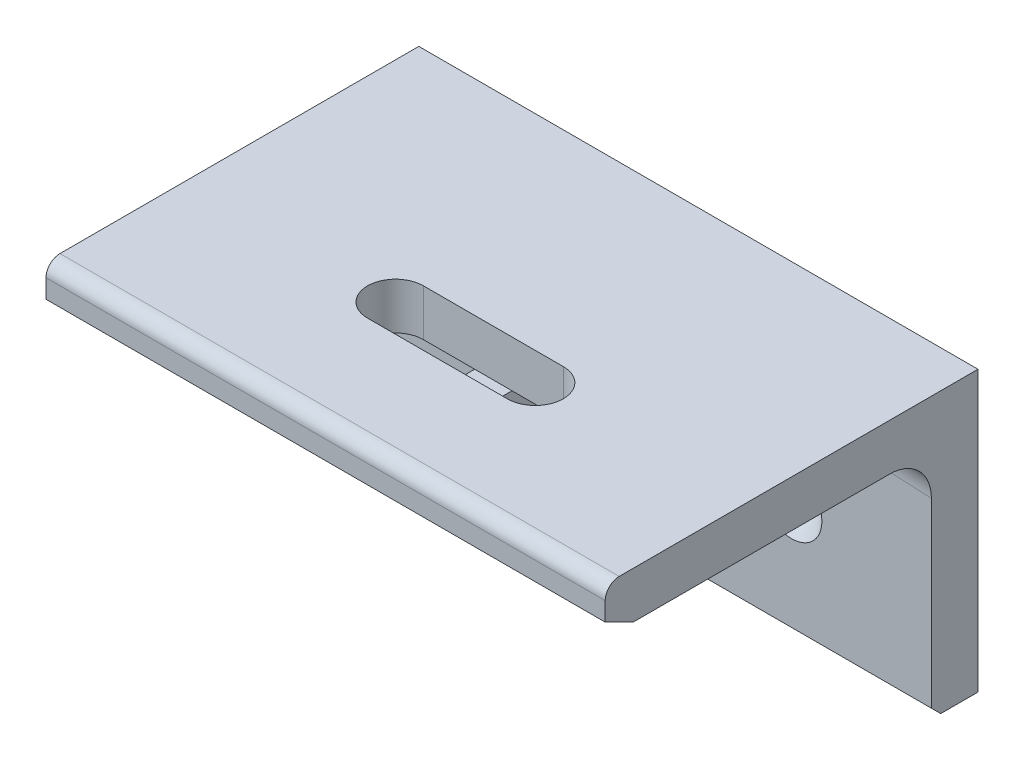
ISO-10303-21;
HEADER;
FILE_DESCRIPTION(('STEP AP214'),'2;1');
FILE_NAME('part.step','',(''),(''),'','','');
FILE_SCHEMA(('AUTOMOTIVE_DESIGN { 1 0 10303 214 1 1 1 1 }'));
ENDSEC;
DATA;
#1=APPLICATION_CONTEXT('core data for automotive mechanical design processes');
#2=APPLICATION_PROTOCOL_DEFINITION('international standard','automotive_design',2000,#1);
#3=PRODUCT_CONTEXT('',#1,'mechanical');
#4=PRODUCT('Part','Part','',(#3));
#5=PRODUCT_RELATED_PRODUCT_CATEGORY('part','',(#4));
#6=PRODUCT_DEFINITION_FORMATION('','',#4);
#7=PRODUCT_DEFINITION_CONTEXT('part definition',#1,'design');
#8=PRODUCT_DEFINITION('design','',#6,#7);
#9=PRODUCT_DEFINITION_SHAPE('','',#8);
#10=(LENGTH_UNIT() NAMED_UNIT(*) SI_UNIT(.MILLI.,.METRE.));
#11=(NAMED_UNIT(*) PLANE_ANGLE_UNIT() SI_UNIT($,.RADIAN.));
#12=(NAMED_UNIT(*) SI_UNIT($,.STERADIAN.) SOLID_ANGLE_UNIT());
#13=UNCERTAINTY_MEASURE_WITH_UNIT(LENGTH_MEASURE(1.E-05),#10,'distance_accuracy_value','');
#14=(GEOMETRIC_REPRESENTATION_CONTEXT(3) GLOBAL_UNCERTAINTY_ASSIGNED_CONTEXT((#13)) GLOBAL_UNIT_ASSIGNED_CONTEXT((#10,
#11,#12)) REPRESENTATION_CONTEXT('',''));
#15=CARTESIAN_POINT('',(0.,0.,0.));
#16=DIRECTION('',(0.,0.,1.));
#17=DIRECTION('',(1.,0.,0.));
#18=AXIS2_PLACEMENT_3D('',#15,#16,#17);
#19=CARTESIAN_POINT('',(0.,50.,0.));
#20=DIRECTION('',(0.,-1.,0.));
#21=DIRECTION('',(0.,0.,-1.));
#22=AXIS2_PLACEMENT_3D('',#19,#20,#21);
#23=PLANE('',#22);
#24=DIRECTION('',(-1.,0.,0.));
#25=VECTOR('',#24,1.);
#26=CARTESIAN_POINT('',(45.,50.,44.));
#27=LINE('',#26,#25);
#28=CARTESIAN_POINT('',(75.,50.,44.));
#29=VERTEX_POINT('',#28);
#30=CARTESIAN_POINT('',(64.,50.,44.));
#31=VERTEX_POINT('',#30);
#32=EDGE_CURVE('E218',#29,#31,#27,.T.);
#33=ORIENTED_EDGE('',*,*,#32,.T.);
#34=DIRECTION('',(0.,0.,1.));
#35=VECTOR('',#34,1.);
#36=CARTESIAN_POINT('',(64.,50.,60.));
#37=LINE('',#36,#35);
#38=CARTESIAN_POINT('',(64.,50.,16.2));
#39=VERTEX_POINT('',#38);
#40=EDGE_CURVE('E307',#39,#31,#37,.T.);
#41=ORIENTED_EDGE('',*,*,#40,.F.);
#42=DIRECTION('',(0.998752338877845,0.,0.0499376169438922));
#43=VECTOR('',#42,1.);
#44=CARTESIAN_POINT('',(0.,50.,13.));
#45=LINE('',#44,#43);
#46=CARTESIAN_POINT('',(120.,50.,19.));
#47=VERTEX_POINT('',#46);
#48=EDGE_CURVE('E397',#39,#47,#45,.T.);
#49=ORIENTED_EDGE('',*,*,#48,.T.);
#50=DIRECTION('',(0.,0.,-1.));
#51=VECTOR('',#50,1.);
#52=CARTESIAN_POINT('',(120.,50.,0.));
#53=LINE('',#52,#51);
#54=CARTESIAN_POINT('',(120.,50.,74.));
#55=VERTEX_POINT('',#54);
#56=EDGE_CURVE('E535',#55,#47,#53,.T.);
#57=ORIENTED_EDGE('',*,*,#56,.F.);
#58=DIRECTION('',(-1.,0.,0.));
#59=VECTOR('',#58,1.);
#60=CARTESIAN_POINT('',(120.007813014407,50.,74.));
#61=LINE('',#60,#59);
#62=CARTESIAN_POINT('',(0.,50.,74.));
#63=VERTEX_POINT('',#62);
#64=EDGE_CURVE('E292',#55,#63,#61,.T.);
#65=ORIENTED_EDGE('',*,*,#64,.T.);
#66=DIRECTION('',(0.,0.,1.));
#67=VECTOR('',#66,1.);
#68=CARTESIAN_POINT('',(0.,50.,80.));
#69=LINE('',#68,#67);
#70=CARTESIAN_POINT('',(0.,50.,13.));
#71=VERTEX_POINT('',#70);
#72=EDGE_CURVE('E592',#71,#63,#69,.T.);
#73=ORIENTED_EDGE('',*,*,#72,.F.);
#74=CARTESIAN_POINT('',(56.,50.,15.8));
#75=VERTEX_POINT('',#74);
#76=EDGE_CURVE('E349',#71,#75,#45,.T.);
#77=ORIENTED_EDGE('',*,*,#76,.T.);
#78=DIRECTION('',(0.,0.,1.));
#79=VECTOR('',#78,1.);
#80=CARTESIAN_POINT('',(56.,50.,60.));
#81=LINE('',#80,#79);
#82=CARTESIAN_POINT('',(56.,50.,44.));
#83=VERTEX_POINT('',#82);
#84=EDGE_CURVE('E321',#75,#83,#81,.T.);
#85=ORIENTED_EDGE('',*,*,#84,.T.);
#86=CARTESIAN_POINT('',(45.,50.,44.));
#87=VERTEX_POINT('',#86);
#88=EDGE_CURVE('E232',#83,#87,#27,.T.);
#89=ORIENTED_EDGE('',*,*,#88,.T.);
#90=CARTESIAN_POINT('',(45.,50.,50.));
#91=DIRECTION('',(0.,1.,0.));
#92=DIRECTION('',(0.,0.,-1.));
#93=AXIS2_PLACEMENT_3D('',#90,#91,#92);
#94=CIRCLE('',#93,6.);
#95=CARTESIAN_POINT('',(45.,50.,56.));
#96=VERTEX_POINT('',#95);
#97=EDGE_CURVE('E211',#87,#96,#94,.T.);
#98=ORIENTED_EDGE('',*,*,#97,.T.);
#99=DIRECTION('',(1.,0.,0.));
#100=VECTOR('',#99,1.);
#101=CARTESIAN_POINT('',(75.,50.,56.));
#102=LINE('',#101,#100);
#103=CARTESIAN_POINT('',(56.,50.,56.));
#104=VERTEX_POINT('',#103);
#105=EDGE_CURVE('E221',#96,#104,#102,.T.);
#106=ORIENTED_EDGE('',*,*,#105,.T.);
#107=CARTESIAN_POINT('',(56.,50.,60.));
#108=VERTEX_POINT('',#107);
#109=EDGE_CURVE('E306',#104,#108,#81,.T.);
#110=ORIENTED_EDGE('',*,*,#109,.T.);
#111=DIRECTION('',(-1.,0.,0.));
#112=VECTOR('',#111,1.);
#113=CARTESIAN_POINT('',(64.,50.,60.));
#114=LINE('',#113,#112);
#115=CARTESIAN_POINT('',(64.,50.,60.));
#116=VERTEX_POINT('',#115);
#117=EDGE_CURVE('E335',#116,#108,#114,.T.);
#118=ORIENTED_EDGE('',*,*,#117,.F.);
#119=CARTESIAN_POINT('',(64.,50.,56.));
#120=VERTEX_POINT('',#119);
#121=EDGE_CURVE('E312',#120,#116,#37,.T.);
#122=ORIENTED_EDGE('',*,*,#121,.F.);
#123=CARTESIAN_POINT('',(75.,50.,56.));
#124=VERTEX_POINT('',#123);
#125=EDGE_CURVE('E228',#120,#124,#102,.T.);
#126=ORIENTED_EDGE('',*,*,#125,.T.);
#127=CARTESIAN_POINT('',(75.,50.,50.));
#128=DIRECTION('',(0.,1.,0.));
#129=DIRECTION('',(0.,0.,-1.));
#130=AXIS2_PLACEMENT_3D('',#127,#128,#129);
#131=CIRCLE('',#130,6.);
#132=EDGE_CURVE('E226',#124,#29,#131,.T.);
#133=ORIENTED_EDGE('',*,*,#132,.T.);
#134=EDGE_LOOP('',(#33,#41,#49,#57,#65,#73,#77,#85,#89,#98,#106,#110,#118,#122,#126,#133));
#135=FACE_BOUND('',#134,.T.);
#136=ADVANCED_FACE('F71',(#135),#23,.T.);
#137=CARTESIAN_POINT('',(0.,60.,10.));
#138=DIRECTION('',(1.,0.,0.));
#139=DIRECTION('',(0.,0.,-1.));
#140=AXIS2_PLACEMENT_3D('',#137,#138,#139);
#141=PLANE('',#140);
#142=DIRECTION('',(0.,0.,-1.));
#143=VECTOR('',#142,1.);
#144=CARTESIAN_POINT('',(0.,0.,10.));
#145=LINE('',#144,#143);
#146=CARTESIAN_POINT('',(0.,0.,7.99999999999998));
#147=VERTEX_POINT('',#146);
#148=CARTESIAN_POINT('',(0.,0.,0.));
#149=VERTEX_POINT('',#148);
#150=EDGE_CURVE('E396',#147,#149,#145,.T.);
#151=ORIENTED_EDGE('',*,*,#150,.F.);
#152=DIRECTION('',(0.,0.707106781186545,0.70710678118655));
#153=VECTOR('',#152,1.);
#154=CARTESIAN_POINT('',(0.,2.,10.));
#155=LINE('',#154,#153);
#156=CARTESIAN_POINT('',(0.,2.,10.));
#157=VERTEX_POINT('',#156);
#158=EDGE_CURVE('E12',#147,#157,#155,.T.);
#159=ORIENTED_EDGE('',*,*,#158,.T.);
#160=DIRECTION('',(0.,-1.,0.));
#161=VECTOR('',#160,1.);
#162=CARTESIAN_POINT('',(0.,60.,10.));
#163=LINE('',#162,#161);
#164=CARTESIAN_POINT('',(0.,47.,10.));
#165=VERTEX_POINT('',#164);
#166=EDGE_CURVE('E559',#165,#157,#163,.T.);
#167=ORIENTED_EDGE('',*,*,#166,.F.);
#168=CARTESIAN_POINT('',(0.,47.,13.));
#169=DIRECTION('',(-1.,0.,0.));
#170=DIRECTION('',(0.,0.,-1.));
#171=AXIS2_PLACEMENT_3D('',#168,#169,#170);
#172=CIRCLE('',#171,3.);
#173=EDGE_CURVE('E339',#71,#165,#172,.T.);
#174=ORIENTED_EDGE('',*,*,#173,.F.);
#175=ORIENTED_EDGE('',*,*,#72,.T.);
#176=DIRECTION('',(0.,-0.447213595499957,-0.894427190999916));
#177=VECTOR('',#176,1.);
#178=CARTESIAN_POINT('',(0.,26.4,26.7999999999999));
#179=LINE('',#178,#177);
#180=CARTESIAN_POINT('',(0.,53.,80.));
#181=VERTEX_POINT('',#180);
#182=EDGE_CURVE('E303',#181,#63,#179,.T.);
#183=ORIENTED_EDGE('',*,*,#182,.F.);
#184=DIRECTION('',(0.,-1.,0.));
#185=VECTOR('',#184,1.);
#186=CARTESIAN_POINT('',(0.,60.,80.));
#187=LINE('',#186,#185);
#188=CARTESIAN_POINT('',(0.,57.,80.));
#189=VERTEX_POINT('',#188);
#190=EDGE_CURVE('E534',#189,#181,#187,.T.);
#191=ORIENTED_EDGE('',*,*,#190,.F.);
#192=CARTESIAN_POINT('',(0.,57.,77.));
#193=DIRECTION('',(1.,0.,0.));
#194=DIRECTION('',(0.,0.,-1.));
#195=AXIS2_PLACEMENT_3D('',#192,#193,#194);
#196=CIRCLE('',#195,3.);
#197=CARTESIAN_POINT('',(0.,60.,77.));
#198=VERTEX_POINT('',#197);
#199=EDGE_CURVE('E542',#189,#198,#196,.F.);
#200=ORIENTED_EDGE('',*,*,#199,.T.);
#201=DIRECTION('',(0.,0.,-1.));
#202=VECTOR('',#201,1.);
#203=CARTESIAN_POINT('',(0.,60.,10.));
#204=LINE('',#203,#202);
#205=CARTESIAN_POINT('',(0.,60.,0.));
#206=VERTEX_POINT('',#205);
#207=EDGE_CURVE('E558',#198,#206,#204,.T.);
#208=ORIENTED_EDGE('',*,*,#207,.T.);
#209=DIRECTION('',(0.,-1.,0.));
#210=VECTOR('',#209,1.);
#211=CARTESIAN_POINT('',(0.,60.,0.));
#212=LINE('',#211,#210);
#213=EDGE_CURVE('E566',#206,#149,#212,.T.);
#214=ORIENTED_EDGE('',*,*,#213,.T.);
#215=EDGE_LOOP('',(#151,#159,#167,#174,#175,#183,#191,#200,#208,#214));
#216=FACE_BOUND('',#215,.T.);
#217=ADVANCED_FACE('F464',(#216),#141,.F.);
#218=CARTESIAN_POINT('',(120.,0.,10.));
#219=DIRECTION('',(-1.,0.,0.));
#220=DIRECTION('',(0.,0.,1.));
#221=AXIS2_PLACEMENT_3D('',#218,#219,#220);
#222=PLANE('',#221);
#223=DIRECTION('',(0.,1.,0.));
#224=VECTOR('',#223,1.);
#225=CARTESIAN_POINT('',(120.,0.,10.));
#226=LINE('',#225,#224);
#227=CARTESIAN_POINT('',(120.,2.,10.));
#228=VERTEX_POINT('',#227);
#229=CARTESIAN_POINT('',(120.,41.,10.));
#230=VERTEX_POINT('',#229);
#231=EDGE_CURVE('E554',#228,#230,#226,.T.);
#232=ORIENTED_EDGE('',*,*,#231,.F.);
#233=DIRECTION('',(0.,-0.707106781186545,-0.70710678118655));
#234=VECTOR('',#233,1.);
#235=CARTESIAN_POINT('',(120.,2.,10.));
#236=LINE('',#235,#234);
#237=CARTESIAN_POINT('',(120.,0.,7.99999999999998));
#238=VERTEX_POINT('',#237);
#239=EDGE_CURVE('E660',#228,#238,#236,.T.);
#240=ORIENTED_EDGE('',*,*,#239,.T.);
#241=DIRECTION('',(0.,0.,-1.));
#242=VECTOR('',#241,1.);
#243=CARTESIAN_POINT('',(120.,0.,10.));
#244=LINE('',#243,#242);
#245=CARTESIAN_POINT('',(120.,0.,0.));
#246=VERTEX_POINT('',#245);
#247=EDGE_CURVE('E587',#238,#246,#244,.T.);
#248=ORIENTED_EDGE('',*,*,#247,.T.);
#249=DIRECTION('',(0.,1.,0.));
#250=VECTOR('',#249,1.);
#251=CARTESIAN_POINT('',(120.,0.,0.));
#252=LINE('',#251,#250);
#253=CARTESIAN_POINT('',(120.,60.,0.));
#254=VERTEX_POINT('',#253);
#255=EDGE_CURVE('E574',#246,#254,#252,.T.);
#256=ORIENTED_EDGE('',*,*,#255,.T.);
#257=DIRECTION('',(0.,0.,-1.));
#258=VECTOR('',#257,1.);
#259=CARTESIAN_POINT('',(120.,60.,10.));
#260=LINE('',#259,#258);
#261=CARTESIAN_POINT('',(120.,60.,77.));
#262=VERTEX_POINT('',#261);
#263=EDGE_CURVE('E584',#262,#254,#260,.T.);
#264=ORIENTED_EDGE('',*,*,#263,.F.);
#265=CARTESIAN_POINT('',(120.,57.,77.));
#266=DIRECTION('',(-1.,0.,0.));
#267=DIRECTION('',(0.,0.,1.));
#268=AXIS2_PLACEMENT_3D('',#265,#266,#267);
#269=CIRCLE('',#268,3.);
#270=CARTESIAN_POINT('',(120.,57.,80.));
#271=VERTEX_POINT('',#270);
#272=EDGE_CURVE('E540',#262,#271,#269,.F.);
#273=ORIENTED_EDGE('',*,*,#272,.T.);
#274=DIRECTION('',(0.,-1.,0.));
#275=VECTOR('',#274,1.);
#276=CARTESIAN_POINT('',(120.,60.,80.));
#277=LINE('',#276,#275);
#278=CARTESIAN_POINT('',(120.,53.,80.));
#279=VERTEX_POINT('',#278);
#280=EDGE_CURVE('E526',#271,#279,#277,.T.);
#281=ORIENTED_EDGE('',*,*,#280,.T.);
#282=DIRECTION('',(0.,0.447213595499957,0.894427190999916));
#283=VECTOR('',#282,1.);
#284=CARTESIAN_POINT('',(120.,14.4000000000001,2.79999999999998));
#285=LINE('',#284,#283);
#286=EDGE_CURVE('E299',#55,#279,#285,.T.);
#287=ORIENTED_EDGE('',*,*,#286,.F.);
#288=ORIENTED_EDGE('',*,*,#56,.T.);
#289=CARTESIAN_POINT('',(120.,41.,19.));
#290=DIRECTION('',(-1.,0.,0.));
#291=DIRECTION('',(0.,0.,-1.));
#292=AXIS2_PLACEMENT_3D('',#289,#290,#291);
#293=CIRCLE('',#292,9.00000000000001);
#294=EDGE_CURVE('E496',#47,#230,#293,.T.);
#295=ORIENTED_EDGE('',*,*,#294,.T.);
#296=EDGE_LOOP('',(#232,#240,#248,#256,#264,#273,#281,#287,#288,#295));
#297=FACE_BOUND('',#296,.T.);
#298=ADVANCED_FACE('F467',(#297),#222,.F.);
#299=CARTESIAN_POINT('',(120.,60.,80.));
#300=DIRECTION('',(0.,0.,-1.));
#301=DIRECTION('',(-1.,0.,0.));
#302=AXIS2_PLACEMENT_3D('',#299,#300,#301);
#303=PLANE('',#302);
#304=ORIENTED_EDGE('',*,*,#280,.F.);
#305=DIRECTION('',(1.,0.,0.));
#306=VECTOR('',#305,1.);
#307=CARTESIAN_POINT('',(120.,57.,80.));
#308=LINE('',#307,#306);
#309=EDGE_CURVE('E528',#271,#189,#308,.F.);
#310=ORIENTED_EDGE('',*,*,#309,.T.);
#311=ORIENTED_EDGE('',*,*,#190,.T.);
#312=DIRECTION('',(-1.,0.,0.));
#313=VECTOR('',#312,1.);
#314=CARTESIAN_POINT('',(120.,53.,80.));
#315=LINE('',#314,#313);
#316=EDGE_CURVE('E531',#279,#181,#315,.T.);
#317=ORIENTED_EDGE('',*,*,#316,.F.);
#318=EDGE_LOOP('',(#304,#310,#311,#317));
#319=FACE_BOUND('',#318,.T.);
#320=ADVANCED_FACE('F472',(#319),#303,.F.);
#321=CARTESIAN_POINT('',(0.,0.,10.));
#322=DIRECTION('',(0.,0.,1.));
#323=DIRECTION('',(1.,0.,0.));
#324=AXIS2_PLACEMENT_3D('',#321,#322,#323);
#325=PLANE('',#324);
#326=CARTESIAN_POINT('',(30.,25.,10.));
#327=DIRECTION('',(0.,0.,1.));
#328=DIRECTION('',(1.,0.,0.));
#329=AXIS2_PLACEMENT_3D('',#326,#327,#328);
#330=CIRCLE('',#329,6.5);
#331=CARTESIAN_POINT('',(36.5,25.,10.));
#332=VERTEX_POINT('',#331);
#333=EDGE_CURVE('E288',#332,#332,#330,.T.);
#334=ORIENTED_EDGE('',*,*,#333,.F.);
#335=EDGE_LOOP('',(#334));
#336=FACE_BOUND('',#335,.T.);
#337=CARTESIAN_POINT('',(90.,25.,10.));
#338=DIRECTION('',(0.,0.,1.));
#339=DIRECTION('',(1.,0.,0.));
#340=AXIS2_PLACEMENT_3D('',#337,#338,#339);
#341=CIRCLE('',#340,6.50000000000001);
#342=CARTESIAN_POINT('',(96.5,25.,10.));
#343=VERTEX_POINT('',#342);
#344=EDGE_CURVE('E287',#343,#343,#341,.T.);
#345=ORIENTED_EDGE('',*,*,#344,.F.);
#346=EDGE_LOOP('',(#345));
#347=FACE_BOUND('',#346,.T.);
#348=ORIENTED_EDGE('',*,*,#166,.T.);
#349=DIRECTION('',(1.,0.,0.));
#350=VECTOR('',#349,1.);
#351=CARTESIAN_POINT('',(120.,2.,10.));
#352=LINE('',#351,#350);
#353=EDGE_CURVE('E548',#157,#228,#352,.T.);
#354=ORIENTED_EDGE('',*,*,#353,.T.);
#355=ORIENTED_EDGE('',*,*,#231,.T.);
#356=DIRECTION('',(0.998752338877845,-0.0499376169438922,0.));
#357=VECTOR('',#356,1.);
#358=CARTESIAN_POINT('',(0.,47.,10.));
#359=LINE('',#358,#357);
#360=CARTESIAN_POINT('',(64.,43.8,10.));
#361=VERTEX_POINT('',#360);
#362=EDGE_CURVE('E499',#361,#230,#359,.T.);
#363=ORIENTED_EDGE('',*,*,#362,.F.);
#364=DIRECTION('',(0.,1.,0.));
#365=VECTOR('',#364,1.);
#366=CARTESIAN_POINT('',(64.,50.,10.));
#367=LINE('',#366,#365);
#368=CARTESIAN_POINT('',(64.,10.,10.));
#369=VERTEX_POINT('',#368);
#370=EDGE_CURVE('E316',#369,#361,#367,.T.);
#371=ORIENTED_EDGE('',*,*,#370,.F.);
#372=DIRECTION('',(-1.,0.,0.));
#373=VECTOR('',#372,1.);
#374=CARTESIAN_POINT('',(64.,10.,10.));
#375=LINE('',#374,#373);
#376=CARTESIAN_POINT('',(56.,10.,10.));
#377=VERTEX_POINT('',#376);
#378=EDGE_CURVE('E320',#369,#377,#375,.T.);
#379=ORIENTED_EDGE('',*,*,#378,.T.);
#380=DIRECTION('',(0.,1.,0.));
#381=VECTOR('',#380,1.);
#382=CARTESIAN_POINT('',(56.,50.,10.));
#383=LINE('',#382,#381);
#384=CARTESIAN_POINT('',(56.,44.2,10.));
#385=VERTEX_POINT('',#384);
#386=EDGE_CURVE('E329',#377,#385,#383,.T.);
#387=ORIENTED_EDGE('',*,*,#386,.T.);
#388=EDGE_CURVE('E623',#165,#385,#359,.T.);
#389=ORIENTED_EDGE('',*,*,#388,.F.);
#390=EDGE_LOOP('',(#348,#354,#355,#363,#371,#379,#387,#389));
#391=FACE_BOUND('',#390,.T.);
#392=ADVANCED_FACE('F518',(#336,#347,#391),#325,.T.);
#393=CARTESIAN_POINT('',(0.,50.,13.));
#394=CARTESIAN_POINT('',(120.,50.,19.));
#395=CARTESIAN_POINT('',(0.,50.,12.8232233047034));
#396=CARTESIAN_POINT('',(120.,50.,18.4696699141101));
#397=CARTESIAN_POINT('',(0.,49.9838909458899,12.6394749853199));
#398=CARTESIAN_POINT('',(120.,49.9528548745652,17.9195073583385));
#399=CARTESIAN_POINT('',(0.,49.9151231175766,12.2680439814133));
#400=CARTESIAN_POINT('',(120.,49.7466417569332,16.8051576982429));
#401=CARTESIAN_POINT('',(0.,49.8624643433734,12.0803612968902));
#402=CARTESIAN_POINT('',(120.,49.5873930301202,16.2410838906706));
#403=CARTESIAN_POINT('',(0.,49.7162654630012,11.7110704457386));
#404=CARTESIAN_POINT('',(120.,49.1487963890035,15.1332113372157));
#405=CARTESIAN_POINT('',(0.,49.6224776277976,11.5300346967234));
#406=CARTESIAN_POINT('',(120.,48.8693449899168,14.5896371505096));
#407=CARTESIAN_POINT('',(0.,49.3982283727802,11.1870626067777));
#408=CARTESIAN_POINT('',(120.,48.1965742120189,13.5605872885578));
#409=CARTESIAN_POINT('',(0.,49.2677669529664,11.0251262658471));
#410=CARTESIAN_POINT('',(120.,47.8033008588991,13.0753787975413));
#411=CARTESIAN_POINT('',(0.,48.9748737341529,10.7322330470336));
#412=CARTESIAN_POINT('',(120.,46.9246212024588,12.1966991411009));
#413=CARTESIAN_POINT('',(0.,48.8129373932223,10.6017716272198));
#414=CARTESIAN_POINT('',(120.,46.4394127114422,11.8034257879811));
#415=CARTESIAN_POINT('',(0.,48.4699653032766,10.3775223722024));
#416=CARTESIAN_POINT('',(120.,45.4103628494903,11.1306550100832));
#417=CARTESIAN_POINT('',(0.,48.2889295542615,10.2837345369988));
#418=CARTESIAN_POINT('',(120.,44.8667886627843,10.8512036109965));
#419=CARTESIAN_POINT('',(0.,47.9196387031098,10.1375356566266));
#420=CARTESIAN_POINT('',(120.,43.7589161093294,10.4126069698798));
#421=CARTESIAN_POINT('',(0.,47.7319560185867,10.0848768824234));
#422=CARTESIAN_POINT('',(120.,43.1948423017571,10.2533582430668));
#423=CARTESIAN_POINT('',(0.,47.3605250146801,10.0161090541101));
#424=CARTESIAN_POINT('',(120.,42.0804926416615,10.0471451254348));
#425=CARTESIAN_POINT('',(0.,47.1767766952966,10.));
#426=CARTESIAN_POINT('',(120.,41.5303300858899,10.));
#427=CARTESIAN_POINT('',(0.,47.,10.));
#428=CARTESIAN_POINT('',(120.,41.,10.));
#429=B_SPLINE_SURFACE_WITH_KNOTS('',3,1,((#393,#394),(#395,#396),(#397,#398),(#399,#400),(#401,
#402),(#403,#404),(#405,#406),(#407,#408),(#409,#410),(#411,#412),(#413,#414),(#415,#416),(#417,
#418),(#419,#420),(#421,#422),(#423,#424),(#425,#426),(#427,#428)),.UNSPECIFIED.,.F.,.F.,.F.,(4,
2,2,2,2,2,2,2,4),(2,2),(0.,0.125,0.25,0.375,0.5,0.625,0.75,0.875,1.),(0.,1.),.UNSPECIFIED.);
#430=CARTESIAN_POINT('',(64.,50.,16.2));
#431=CARTESIAN_POINT('',(64.,49.9999687193606,16.0256000696815));
#432=CARTESIAN_POINT('',(64.,49.9925566671614,15.8512007509311));
#433=CARTESIAN_POINT('',(64.,49.9630964198957,15.5036383285874));
#434=CARTESIAN_POINT('',(64.,49.9410478830944,15.3304752539536));
#435=CARTESIAN_POINT('',(64.,49.8824634288315,14.986765556761));
#436=CARTESIAN_POINT('',(64.,49.8459390686207,14.8162169594));
#437=CARTESIAN_POINT('',(64.,49.7587023336513,14.4787724278152));
#438=CARTESIAN_POINT('',(64.,49.7079905668795,14.3118763373974));
#439=CARTESIAN_POINT('',(64.,49.6214918310891,14.0651290822042));
#440=CARTESIAN_POINT('',(64.,49.5908962429059,13.9834255893316));
#441=CARTESIAN_POINT('',(64.,49.5262377182265,13.8214023118593));
#442=CARTESIAN_POINT('',(64.,49.4921747889522,13.7410825243782));
#443=CARTESIAN_POINT('',(64.,49.384936131138,13.5023962976096));
#444=CARTESIAN_POINT('',(64.,49.3066992945905,13.3462709996749));
#445=CARTESIAN_POINT('',(64.,49.1374497723724,13.0411681942608));
#446=CARTESIAN_POINT('',(64.,49.0464395183326,12.8921893335653));
#447=CARTESIAN_POINT('',(64.,48.8521709918913,12.6024466018387));
#448=CARTESIAN_POINT('',(64.,48.7489128230143,12.4616826613868));
#449=CARTESIAN_POINT('',(64.,48.531033502181,12.189346527546));
#450=CARTESIAN_POINT('',(64.,48.4164189462691,12.0577690732743));
#451=CARTESIAN_POINT('',(64.,48.236453493969,11.8680910230294));
#452=CARTESIAN_POINT('',(64.,48.1751177209058,11.8061404176552));
#453=CARTESIAN_POINT('',(64.,48.0498545697312,11.6849169640287));
#454=CARTESIAN_POINT('',(64.,47.9859271670337,11.625644141191));
#455=CARTESIAN_POINT('',(64.,47.7904702478499,11.4519311744386));
#456=CARTESIAN_POINT('',(64.,47.6552579278241,11.341588019893));
#457=CARTESIAN_POINT('',(64.,47.3760764435896,11.1326354487507));
#458=CARTESIAN_POINT('',(64.,47.2321070500518,11.0340263396437));
#459=CARTESIAN_POINT('',(64.,46.9365061962865,10.8493827333324));
#460=CARTESIAN_POINT('',(64.,46.7848829092973,10.763335189114));
#461=CARTESIAN_POINT('',(64.,46.4750271608066,10.604228123879));
#462=CARTESIAN_POINT('',(64.,46.3167946149128,10.5311687687684));
#463=CARTESIAN_POINT('',(64.,45.833794360339,10.3326865298756));
#464=CARTESIAN_POINT('',(64.,45.5002828050437,10.2276833342147));
#465=CARTESIAN_POINT('',(64.,44.9373645673073,10.1011011184141));
#466=CARTESIAN_POINT('',(64.,44.711404632801,10.0632687318992));
#467=CARTESIAN_POINT('',(64.,44.2570154238897,10.0127518556922));
#468=CARTESIAN_POINT('',(64.,44.0285900888762,10.0000319150534));
#469=CARTESIAN_POINT('',(64.,43.8,10.));
#470=B_SPLINE_CURVE_WITH_KNOTS('',3,(#430,#431,#432,#433,#434,#435,#436,#437,#438,#439,#440,
#441,#442,#443,#444,#445,#446,#447,#448,#449,#450,#451,#452,#453,#454,#455,#456,#457,#458,#459,
#460,#461,#462,#463,#464,#465,#466,#467,#468,#469),.UNSPECIFIED.,.F.,.F.,(4,2,2,2,2,2,2,2,2,2,2,
2,2,2,2,2,2,2,2,4),(0.,0.52304863212782,1.04610947690488,1.56875355734358,2.09137524384335,
2.35303927932949,2.61470276982386,3.13792835105721,3.66105446243064,4.1841761524451,
4.70699576316886,4.96845906653275,5.2299248509021,5.75282129755916,6.27573144366113,
6.79809454712233,7.32046432256775,8.3636617836826,9.04973468217064,9.73483836504256),.UNSPECIFIED.);
#471=EDGE_CURVE('E395',#39,#361,#470,.T.);
#472=ORIENTED_EDGE('',*,*,#48,.F.);
#473=ORIENTED_EDGE('',*,*,#471,.T.);
#474=ORIENTED_EDGE('',*,*,#362,.T.);
#475=ORIENTED_EDGE('',*,*,#294,.F.);
#476=EDGE_LOOP('',(#472,#473,#474,#475));
#477=FACE_BOUND('',#476,.T.);
#478=ADVANCED_FACE('F368',(#477),#429,.T.);
#479=CARTESIAN_POINT('',(0.,0.,10.));
#480=DIRECTION('',(0.,1.,0.));
#481=DIRECTION('',(0.,0.,1.));
#482=AXIS2_PLACEMENT_3D('',#479,#480,#481);
#483=PLANE('',#482);
#484=ORIENTED_EDGE('',*,*,#247,.F.);
#485=DIRECTION('',(-1.,0.,0.));
#486=VECTOR('',#485,1.);
#487=CARTESIAN_POINT('',(0.,0.,7.99999999999998));
#488=LINE('',#487,#486);
#489=EDGE_CURVE('E81',#238,#147,#488,.T.);
#490=ORIENTED_EDGE('',*,*,#489,.T.);
#491=ORIENTED_EDGE('',*,*,#150,.T.);
#492=DIRECTION('',(1.,0.,0.));
#493=VECTOR('',#492,1.);
#494=CARTESIAN_POINT('',(0.,0.,0.));
#495=LINE('',#494,#493);
#496=EDGE_CURVE('E570',#149,#246,#495,.T.);
#497=ORIENTED_EDGE('',*,*,#496,.T.);
#498=EDGE_LOOP('',(#484,#490,#491,#497));
#499=FACE_BOUND('',#498,.T.);
#500=ADVANCED_FACE('F480',(#499),#483,.F.);
#501=CARTESIAN_POINT('',(120.,60.,10.));
#502=DIRECTION('',(0.,-1.,0.));
#503=DIRECTION('',(0.,0.,-1.));
#504=AXIS2_PLACEMENT_3D('',#501,#502,#503);
#505=PLANE('',#504);
#506=DIRECTION('',(1.,0.,0.));
#507=VECTOR('',#506,1.);
#508=CARTESIAN_POINT('',(75.,60.,56.));
#509=LINE('',#508,#507);
#510=CARTESIAN_POINT('',(45.,60.,56.));
#511=VERTEX_POINT('',#510);
#512=CARTESIAN_POINT('',(75.,60.,56.));
#513=VERTEX_POINT('',#512);
#514=EDGE_CURVE('E253',#511,#513,#509,.T.);
#515=ORIENTED_EDGE('',*,*,#514,.F.);
#516=CARTESIAN_POINT('',(45.,60.,50.));
#517=DIRECTION('',(0.,1.,0.));
#518=DIRECTION('',(0.,0.,-1.));
#519=AXIS2_PLACEMENT_3D('',#516,#517,#518);
#520=CIRCLE('',#519,6.);
#521=CARTESIAN_POINT('',(45.,60.,44.));
#522=VERTEX_POINT('',#521);
#523=EDGE_CURVE('E88',#522,#511,#520,.T.);
#524=ORIENTED_EDGE('',*,*,#523,.F.);
#525=DIRECTION('',(-1.,0.,0.));
#526=VECTOR('',#525,1.);
#527=CARTESIAN_POINT('',(45.,60.,44.));
#528=LINE('',#527,#526);
#529=CARTESIAN_POINT('',(75.,60.,44.));
#530=VERTEX_POINT('',#529);
#531=EDGE_CURVE('E234',#530,#522,#528,.T.);
#532=ORIENTED_EDGE('',*,*,#531,.F.);
#533=CARTESIAN_POINT('',(75.,60.,50.));
#534=DIRECTION('',(0.,1.,0.));
#535=DIRECTION('',(0.,0.,-1.));
#536=AXIS2_PLACEMENT_3D('',#533,#534,#535);
#537=CIRCLE('',#536,6.);
#538=EDGE_CURVE('E242',#513,#530,#537,.T.);
#539=ORIENTED_EDGE('',*,*,#538,.F.);
#540=EDGE_LOOP('',(#515,#524,#532,#539));
#541=FACE_BOUND('',#540,.T.);
#542=ORIENTED_EDGE('',*,*,#207,.F.);
#543=DIRECTION('',(1.,0.,0.));
#544=VECTOR('',#543,1.);
#545=CARTESIAN_POINT('',(120.,60.,77.));
#546=LINE('',#545,#544);
#547=EDGE_CURVE('E550',#198,#262,#546,.T.);
#548=ORIENTED_EDGE('',*,*,#547,.T.);
#549=ORIENTED_EDGE('',*,*,#263,.T.);
#550=DIRECTION('',(-1.,0.,0.));
#551=VECTOR('',#550,1.);
#552=CARTESIAN_POINT('',(120.,60.,0.));
#553=LINE('',#552,#551);
#554=EDGE_CURVE('E578',#254,#206,#553,.T.);
#555=ORIENTED_EDGE('',*,*,#554,.T.);
#556=EDGE_LOOP('',(#542,#548,#549,#555));
#557=FACE_BOUND('',#556,.T.);
#558=ADVANCED_FACE('F510',(#541,#557),#505,.F.);
#559=CARTESIAN_POINT('',(0.,0.,0.));
#560=DIRECTION('',(0.,0.,1.));
#561=DIRECTION('',(1.,0.,0.));
#562=AXIS2_PLACEMENT_3D('',#559,#560,#561);
#563=PLANE('',#562);
#564=CARTESIAN_POINT('',(30.,25.,0.));
#565=DIRECTION('',(0.,0.,1.));
#566=DIRECTION('',(1.,0.,0.));
#567=AXIS2_PLACEMENT_3D('',#564,#565,#566);
#568=CIRCLE('',#567,3.3);
#569=CARTESIAN_POINT('',(33.3,25.,0.));
#570=VERTEX_POINT('',#569);
#571=EDGE_CURVE('E272',#570,#570,#568,.T.);
#572=ORIENTED_EDGE('',*,*,#571,.T.);
#573=EDGE_LOOP('',(#572));
#574=FACE_BOUND('',#573,.T.);
#575=CARTESIAN_POINT('',(90.,25.,0.));
#576=DIRECTION('',(0.,0.,1.));
#577=DIRECTION('',(1.,0.,0.));
#578=AXIS2_PLACEMENT_3D('',#575,#576,#577);
#579=CIRCLE('',#578,3.3);
#580=CARTESIAN_POINT('',(93.3,25.,0.));
#581=VERTEX_POINT('',#580);
#582=EDGE_CURVE('E271',#581,#581,#579,.T.);
#583=ORIENTED_EDGE('',*,*,#582,.T.);
#584=EDGE_LOOP('',(#583));
#585=FACE_BOUND('',#584,.T.);
#586=ORIENTED_EDGE('',*,*,#496,.F.);
#587=ORIENTED_EDGE('',*,*,#213,.F.);
#588=ORIENTED_EDGE('',*,*,#554,.F.);
#589=ORIENTED_EDGE('',*,*,#255,.F.);
#590=EDGE_LOOP('',(#586,#587,#588,#589));
#591=FACE_BOUND('',#590,.T.);
#592=ADVANCED_FACE('F367',(#574,#585,#591),#563,.F.);
#593=CARTESIAN_POINT('',(56.,50.,15.8));
#594=CARTESIAN_POINT('',(56.,49.9999698123251,15.6367878305563));
#595=CARTESIAN_POINT('',(56.,49.9930230369284,15.4735775336246));
#596=CARTESIAN_POINT('',(56.,49.9654267458737,15.1483125953991));
#597=CARTESIAN_POINT('',(56.,49.9447766901956,14.9862579999037));
#598=CARTESIAN_POINT('',(56.,49.889926390727,14.6645989880676));
#599=CARTESIAN_POINT('',(56.,49.8557370720924,14.5049927037239));
#600=CARTESIAN_POINT('',(56.,49.7740774607814,14.1891998314571));
#601=CARTESIAN_POINT('',(56.,49.7266078329068,14.0330130727769));
#602=CARTESIAN_POINT('',(56.,49.6456415930831,13.8021275281607));
#603=CARTESIAN_POINT('',(56.,49.6170079766656,13.7256915344572));
#604=CARTESIAN_POINT('',(56.,49.5564931514772,13.5741161870847));
#605=CARTESIAN_POINT('',(56.,49.5246121566572,13.498976748374));
#606=CARTESIAN_POINT('',(56.,49.4576968426586,13.3501220840879));
#607=CARTESIAN_POINT('',(56.,49.4226627288936,13.2764067661159));
#608=CARTESIAN_POINT('',(56.,49.349521895196,13.1304984824724));
#609=CARTESIAN_POINT('',(56.,49.3114143870217,13.0583059133719));
#610=CARTESIAN_POINT('',(56.,49.1926282354906,12.8442754259403));
#611=CARTESIAN_POINT('',(56.,49.1074488422748,12.7049022439573));
#612=CARTESIAN_POINT('',(56.,48.9256451504002,12.4338314223232));
#613=CARTESIAN_POINT('',(56.,48.82902080854,12.3021338116478));
#614=CARTESIAN_POINT('',(56.,48.6761177860708,12.1110498477638));
#615=CARTESIAN_POINT('',(56.,48.6238260181618,12.0484361284615));
#616=CARTESIAN_POINT('',(56.,48.5166617022356,11.9254796295041));
#617=CARTESIAN_POINT('',(56.,48.4617898414703,11.8651362527273));
#618=CARTESIAN_POINT('',(56.,48.3495186152548,11.7468385062648));
#619=CARTESIAN_POINT('',(56.,48.2921190518309,11.6888843243953));
#620=CARTESIAN_POINT('',(56.,48.1748926226425,11.5754846682123));
#621=CARTESIAN_POINT('',(56.,48.1150655788279,11.5200393785535));
#622=CARTESIAN_POINT('',(56.,47.9321475595628,11.3575521277766));
#623=CARTESIAN_POINT('',(56.,47.8056080670138,11.2543465564257));
#624=CARTESIAN_POINT('',(56.,47.5443423676488,11.0589113819521));
#625=CARTESIAN_POINT('',(56.,47.4096158713791,10.9666821672427));
#626=CARTESIAN_POINT('',(56.,47.1330506232434,10.7940040318033));
#627=CARTESIAN_POINT('',(56.,46.9912219050723,10.7135390881155));
#628=CARTESIAN_POINT('',(56.,46.7013852425205,10.5647580067909));
#629=CARTESIAN_POINT('',(56.,46.5533772861838,10.4964418926618));
#630=CARTESIAN_POINT('',(56.,46.101583197971,10.3108732596978));
#631=CARTESIAN_POINT('',(56.,45.7896146105848,10.2127424529802));
#632=CARTESIAN_POINT('',(56.,45.2631992350405,10.0944716201633));
#633=CARTESIAN_POINT('',(56.,45.0519722214342,10.0591287850869));
#634=CARTESIAN_POINT('',(56.,44.6272132565672,10.0119279648559));
#635=CARTESIAN_POINT('',(56.,44.4136849749097,10.0000369387421));
#636=CARTESIAN_POINT('',(56.,44.2,10.));
#637=B_SPLINE_CURVE_WITH_KNOTS('',3,(#593,#594,#595,#596,#597,#598,#599,#600,#601,#602,#603,
#604,#605,#606,#607,#608,#609,#610,#611,#612,#613,#614,#615,#616,#617,#618,#619,#620,#621,#622,
#623,#624,#625,#626,#627,#628,#629,#630,#631,#632,#633,#634,#635,#636),.UNSPECIFIED.,.F.,.F.,(4,
2,2,2,2,2,2,2,2,2,2,2,2,2,2,2,2,2,2,2,2,4),(0.,0.489492787772861,0.979004866665044,
1.46812274877271,1.95721615040252,2.20202446316101,2.44681665734466,2.6915929157884,
2.93643215352087,3.42584013348549,3.91524996087671,4.15992306868802,4.40453136878341,
4.6491588611746,4.89380432899015,5.38304480062153,5.87230257955193,6.3608876534714,
6.84947367277912,7.82520500308838,8.4665374524848,9.10696568933493),.UNSPECIFIED.);
#638=EDGE_CURVE('E388',#75,#385,#637,.T.);
#639=ORIENTED_EDGE('',*,*,#638,.F.);
#640=ORIENTED_EDGE('',*,*,#76,.F.);
#641=ORIENTED_EDGE('',*,*,#173,.T.);
#642=ORIENTED_EDGE('',*,*,#388,.T.);
#643=EDGE_LOOP('',(#639,#640,#641,#642));
#644=FACE_BOUND('',#643,.T.);
#645=ADVANCED_FACE('F352',(#644),#429,.T.);
#646=CARTESIAN_POINT('',(64.,10.,10.));
#647=DIRECTION('',(0.,0.78086880944303,-0.624695047554424));
#648=DIRECTION('',(0.,0.624695047554424,0.78086880944303));
#649=AXIS2_PLACEMENT_3D('',#646,#647,#648);
#650=PLANE('',#649);
#651=DIRECTION('',(0.,-0.624695047554424,-0.78086880944303));
#652=VECTOR('',#651,1.);
#653=CARTESIAN_POINT('',(56.,10.,10.));
#654=LINE('',#653,#652);
#655=EDGE_CURVE('E324',#108,#377,#654,.T.);
#656=ORIENTED_EDGE('',*,*,#655,.T.);
#657=ORIENTED_EDGE('',*,*,#378,.F.);
#658=DIRECTION('',(0.,-0.624695047554424,-0.78086880944303));
#659=VECTOR('',#658,1.);
#660=CARTESIAN_POINT('',(64.,10.,10.));
#661=LINE('',#660,#659);
#662=EDGE_CURVE('E311',#116,#369,#661,.T.);
#663=ORIENTED_EDGE('',*,*,#662,.F.);
#664=ORIENTED_EDGE('',*,*,#117,.T.);
#665=EDGE_LOOP('',(#656,#657,#663,#664));
#666=FACE_BOUND('',#665,.T.);
#667=ADVANCED_FACE('F366',(#666),#650,.F.);
#668=CARTESIAN_POINT('',(64.,0.,0.));
#669=DIRECTION('',(-1.,0.,0.));
#670=DIRECTION('',(0.,0.,1.));
#671=AXIS2_PLACEMENT_3D('',#668,#669,#670);
#672=PLANE('',#671);
#673=ORIENTED_EDGE('',*,*,#471,.F.);
#674=ORIENTED_EDGE('',*,*,#40,.T.);
#675=DIRECTION('',(0.,0.,1.));
#676=VECTOR('',#675,1.);
#677=CARTESIAN_POINT('',(64.,50.,0.));
#678=LINE('',#677,#676);
#679=EDGE_CURVE('E262',#31,#120,#678,.T.);
#680=ORIENTED_EDGE('',*,*,#679,.T.);
#681=ORIENTED_EDGE('',*,*,#121,.T.);
#682=ORIENTED_EDGE('',*,*,#662,.T.);
#683=ORIENTED_EDGE('',*,*,#370,.T.);
#684=EDGE_LOOP('',(#673,#674,#680,#681,#682,#683));
#685=FACE_BOUND('',#684,.T.);
#686=ADVANCED_FACE('F412',(#685),#672,.F.);
#687=CARTESIAN_POINT('',(56.,0.,0.));
#688=DIRECTION('',(-1.,0.,0.));
#689=DIRECTION('',(0.,0.,1.));
#690=AXIS2_PLACEMENT_3D('',#687,#688,#689);
#691=PLANE('',#690);
#692=ORIENTED_EDGE('',*,*,#84,.F.);
#693=ORIENTED_EDGE('',*,*,#638,.T.);
#694=ORIENTED_EDGE('',*,*,#386,.F.);
#695=ORIENTED_EDGE('',*,*,#655,.F.);
#696=ORIENTED_EDGE('',*,*,#109,.F.);
#697=EDGE_CURVE('E325',#83,#104,#81,.T.);
#698=ORIENTED_EDGE('',*,*,#697,.F.);
#699=EDGE_LOOP('',(#692,#693,#694,#695,#696,#698));
#700=FACE_BOUND('',#699,.T.);
#701=ADVANCED_FACE('F406',(#700),#691,.T.);
#702=CARTESIAN_POINT('',(120.007813014407,50.,74.));
#703=DIRECTION('',(0.,-0.894427190999916,0.447213595499957));
#704=DIRECTION('',(0.,-0.447213595499957,-0.894427190999916));
#705=AXIS2_PLACEMENT_3D('',#702,#703,#704);
#706=PLANE('',#705);
#707=ORIENTED_EDGE('',*,*,#182,.T.);
#708=ORIENTED_EDGE('',*,*,#64,.F.);
#709=ORIENTED_EDGE('',*,*,#286,.T.);
#710=ORIENTED_EDGE('',*,*,#316,.T.);
#711=EDGE_LOOP('',(#707,#708,#709,#710));
#712=FACE_BOUND('',#711,.T.);
#713=ADVANCED_FACE('F411',(#712),#706,.T.);
#714=CARTESIAN_POINT('',(120.,57.,77.));
#715=DIRECTION('',(1.,0.,0.));
#716=DIRECTION('',(0.,0.,-1.));
#717=AXIS2_PLACEMENT_3D('',#714,#715,#716);
#718=CYLINDRICAL_SURFACE('',#717,3.);
#719=ORIENTED_EDGE('',*,*,#199,.F.);
#720=ORIENTED_EDGE('',*,*,#309,.F.);
#721=ORIENTED_EDGE('',*,*,#272,.F.);
#722=ORIENTED_EDGE('',*,*,#547,.F.);
#723=EDGE_LOOP('',(#719,#720,#721,#722));
#724=FACE_BOUND('',#723,.T.);
#725=ADVANCED_FACE('F421',(#724),#718,.T.);
#726=CARTESIAN_POINT('',(0.,2.,10.));
#727=DIRECTION('',(0.,-0.70710678118655,0.707106781186545));
#728=DIRECTION('',(-1.,0.,0.));
#729=AXIS2_PLACEMENT_3D('',#726,#727,#728);
#730=PLANE('',#729);
#731=ORIENTED_EDGE('',*,*,#158,.F.);
#732=ORIENTED_EDGE('',*,*,#489,.F.);
#733=ORIENTED_EDGE('',*,*,#239,.F.);
#734=ORIENTED_EDGE('',*,*,#353,.F.);
#735=EDGE_LOOP('',(#731,#732,#733,#734));
#736=FACE_BOUND('',#735,.T.);
#737=ADVANCED_FACE('F74',(#736),#730,.T.);
#738=CARTESIAN_POINT('',(90.,25.,10.));
#739=DIRECTION('',(0.,0.,1.));
#740=DIRECTION('',(1.,0.,0.));
#741=AXIS2_PLACEMENT_3D('',#738,#739,#740);
#742=CONICAL_SURFACE('',#741,6.50000000000001,0.785398163397448);
#743=CARTESIAN_POINT('',(90.,25.,6.8));
#744=DIRECTION('',(0.,0.,1.));
#745=DIRECTION('',(1.,0.,0.));
#746=AXIS2_PLACEMENT_3D('',#743,#744,#745);
#747=CIRCLE('',#746,3.3);
#748=CARTESIAN_POINT('',(93.3,25.,6.8));
#749=VERTEX_POINT('',#748);
#750=EDGE_CURVE('E283',#749,#749,#747,.T.);
#751=ORIENTED_EDGE('',*,*,#750,.F.);
#752=EDGE_LOOP('',(#751));
#753=FACE_BOUND('',#752,.T.);
#754=ORIENTED_EDGE('',*,*,#344,.T.);
#755=EDGE_LOOP('',(#754));
#756=FACE_BOUND('',#755,.T.);
#757=ADVANCED_FACE('F424',(#753,#756),#742,.F.);
#758=CARTESIAN_POINT('',(30.,25.,10.));
#759=DIRECTION('',(0.,0.,1.));
#760=DIRECTION('',(1.,0.,0.));
#761=AXIS2_PLACEMENT_3D('',#758,#759,#760);
#762=CONICAL_SURFACE('',#761,6.5,0.785398163397448);
#763=CARTESIAN_POINT('',(30.,25.,6.8));
#764=DIRECTION('',(0.,0.,1.));
#765=DIRECTION('',(1.,0.,0.));
#766=AXIS2_PLACEMENT_3D('',#763,#764,#765);
#767=CIRCLE('',#766,3.3);
#768=CARTESIAN_POINT('',(33.3,25.,6.8));
#769=VERTEX_POINT('',#768);
#770=EDGE_CURVE('E276',#769,#769,#767,.T.);
#771=ORIENTED_EDGE('',*,*,#770,.F.);
#772=EDGE_LOOP('',(#771));
#773=FACE_BOUND('',#772,.T.);
#774=ORIENTED_EDGE('',*,*,#333,.T.);
#775=EDGE_LOOP('',(#774));
#776=FACE_BOUND('',#775,.T.);
#777=ADVANCED_FACE('F428',(#773,#776),#762,.F.);
#778=CARTESIAN_POINT('',(30.,25.,0.));
#779=DIRECTION('',(0.,0.,1.));
#780=DIRECTION('',(1.,0.,0.));
#781=AXIS2_PLACEMENT_3D('',#778,#779,#780);
#782=CYLINDRICAL_SURFACE('',#781,3.3);
#783=ORIENTED_EDGE('',*,*,#770,.T.);
#784=EDGE_LOOP('',(#783));
#785=FACE_BOUND('',#784,.T.);
#786=ORIENTED_EDGE('',*,*,#571,.F.);
#787=EDGE_LOOP('',(#786));
#788=FACE_BOUND('',#787,.T.);
#789=ADVANCED_FACE('F433',(#785,#788),#782,.F.);
#790=CARTESIAN_POINT('',(90.,25.,0.));
#791=DIRECTION('',(0.,0.,1.));
#792=DIRECTION('',(1.,0.,0.));
#793=AXIS2_PLACEMENT_3D('',#790,#791,#792);
#794=CYLINDRICAL_SURFACE('',#793,3.3);
#795=ORIENTED_EDGE('',*,*,#750,.T.);
#796=EDGE_LOOP('',(#795));
#797=FACE_BOUND('',#796,.T.);
#798=ORIENTED_EDGE('',*,*,#582,.F.);
#799=EDGE_LOOP('',(#798));
#800=FACE_BOUND('',#799,.T.);
#801=ADVANCED_FACE('F436',(#797,#800),#794,.F.);
#802=CARTESIAN_POINT('',(45.,50.,50.));
#803=DIRECTION('',(0.,-1.,0.));
#804=DIRECTION('',(0.,0.,-1.));
#805=AXIS2_PLACEMENT_3D('',#802,#803,#804);
#806=PLANE('',#805);
#807=EDGE_CURVE('E250',#31,#83,#27,.T.);
#808=ORIENTED_EDGE('',*,*,#807,.T.);
#809=ORIENTED_EDGE('',*,*,#697,.T.);
#810=EDGE_CURVE('E96',#104,#120,#102,.T.);
#811=ORIENTED_EDGE('',*,*,#810,.T.);
#812=ORIENTED_EDGE('',*,*,#679,.F.);
#813=EDGE_LOOP('',(#808,#809,#811,#812));
#814=FACE_BOUND('',#813,.T.);
#815=ADVANCED_FACE('F440',(#814),#806,.F.);
#816=CARTESIAN_POINT('',(45.,50.,50.));
#817=DIRECTION('',(0.,1.,0.));
#818=DIRECTION('',(0.,0.,1.));
#819=AXIS2_PLACEMENT_3D('',#816,#817,#818);
#820=CYLINDRICAL_SURFACE('',#819,6.);
#821=ORIENTED_EDGE('',*,*,#523,.T.);
#822=DIRECTION('',(0.,1.,0.));
#823=VECTOR('',#822,1.);
#824=CARTESIAN_POINT('',(45.,50.,56.));
#825=LINE('',#824,#823);
#826=EDGE_CURVE('E207',#96,#511,#825,.T.);
#827=ORIENTED_EDGE('',*,*,#826,.F.);
#828=ORIENTED_EDGE('',*,*,#97,.F.);
#829=DIRECTION('',(0.,1.,0.));
#830=VECTOR('',#829,1.);
#831=CARTESIAN_POINT('',(45.,50.,44.));
#832=LINE('',#831,#830);
#833=EDGE_CURVE('E259',#87,#522,#832,.T.);
#834=ORIENTED_EDGE('',*,*,#833,.T.);
#835=EDGE_LOOP('',(#821,#827,#828,#834));
#836=FACE_BOUND('',#835,.T.);
#837=ADVANCED_FACE('F209',(#836),#820,.F.);
#838=CARTESIAN_POINT('',(45.,50.,44.));
#839=DIRECTION('',(0.,0.,-1.));
#840=DIRECTION('',(-1.,0.,0.));
#841=AXIS2_PLACEMENT_3D('',#838,#839,#840);
#842=PLANE('',#841);
#843=ORIENTED_EDGE('',*,*,#531,.T.);
#844=ORIENTED_EDGE('',*,*,#833,.F.);
#845=ORIENTED_EDGE('',*,*,#88,.F.);
#846=ORIENTED_EDGE('',*,*,#807,.F.);
#847=ORIENTED_EDGE('',*,*,#32,.F.);
#848=DIRECTION('',(0.,1.,0.));
#849=VECTOR('',#848,1.);
#850=CARTESIAN_POINT('',(75.,50.,44.));
#851=LINE('',#850,#849);
#852=EDGE_CURVE('E263',#29,#530,#851,.T.);
#853=ORIENTED_EDGE('',*,*,#852,.T.);
#854=EDGE_LOOP('',(#843,#844,#845,#846,#847,#853));
#855=FACE_BOUND('',#854,.T.);
#856=ADVANCED_FACE('F449',(#855),#842,.F.);
#857=CARTESIAN_POINT('',(75.,50.,50.));
#858=DIRECTION('',(0.,1.,0.));
#859=DIRECTION('',(0.,0.,1.));
#860=AXIS2_PLACEMENT_3D('',#857,#858,#859);
#861=CYLINDRICAL_SURFACE('',#860,6.);
#862=ORIENTED_EDGE('',*,*,#538,.T.);
#863=ORIENTED_EDGE('',*,*,#852,.F.);
#864=ORIENTED_EDGE('',*,*,#132,.F.);
#865=DIRECTION('',(0.,1.,0.));
#866=VECTOR('',#865,1.);
#867=CARTESIAN_POINT('',(75.,50.,56.));
#868=LINE('',#867,#866);
#869=EDGE_CURVE('E217',#124,#513,#868,.T.);
#870=ORIENTED_EDGE('',*,*,#869,.T.);
#871=EDGE_LOOP('',(#862,#863,#864,#870));
#872=FACE_BOUND('',#871,.T.);
#873=ADVANCED_FACE('F454',(#872),#861,.F.);
#874=CARTESIAN_POINT('',(75.,50.,56.));
#875=DIRECTION('',(0.,0.,1.));
#876=DIRECTION('',(1.,0.,0.));
#877=AXIS2_PLACEMENT_3D('',#874,#875,#876);
#878=PLANE('',#877);
#879=ORIENTED_EDGE('',*,*,#514,.T.);
#880=ORIENTED_EDGE('',*,*,#869,.F.);
#881=ORIENTED_EDGE('',*,*,#125,.F.);
#882=ORIENTED_EDGE('',*,*,#810,.F.);
#883=ORIENTED_EDGE('',*,*,#105,.F.);
#884=ORIENTED_EDGE('',*,*,#826,.T.);
#885=EDGE_LOOP('',(#879,#880,#881,#882,#883,#884));
#886=FACE_BOUND('',#885,.T.);
#887=ADVANCED_FACE('F222',(#886),#878,.F.);
#888=CLOSED_SHELL('',(#136,#217,#298,#320,#392,#478,#500,#558,#592,#645,#667,#686,#701,#713,
#725,#737,#757,#777,#789,#801,#815,#837,#856,#873,#887));
#889=MANIFOLD_SOLID_BREP('B2',#888);
#890=ADVANCED_BREP_SHAPE_REPRESENTATION('',(#18,#889),#14);
#891=SHAPE_DEFINITION_REPRESENTATION(#9,#890);
ENDSEC;
END-ISO-10303-21;
